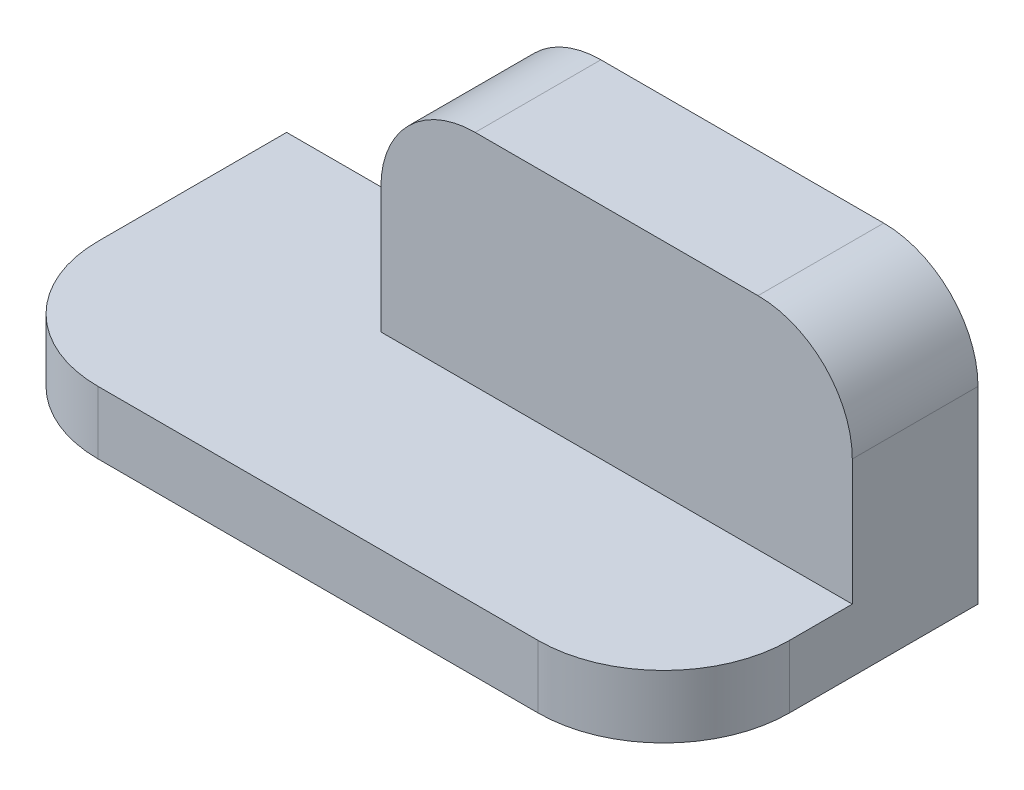
ISO-10303-21;
HEADER;
FILE_DESCRIPTION(('STEP AP214'),'2;1');
FILE_NAME('part.step','',(''),(''),'','','');
FILE_SCHEMA(('AUTOMOTIVE_DESIGN { 1 0 10303 214 1 1 1 1 }'));
ENDSEC;
DATA;
#1=APPLICATION_CONTEXT('core data for automotive mechanical design processes');
#2=APPLICATION_PROTOCOL_DEFINITION('international standard','automotive_design',2000,#1);
#3=PRODUCT_CONTEXT('',#1,'mechanical');
#4=PRODUCT('Part','Part','',(#3));
#5=PRODUCT_RELATED_PRODUCT_CATEGORY('part','',(#4));
#6=PRODUCT_DEFINITION_FORMATION('','',#4);
#7=PRODUCT_DEFINITION_CONTEXT('part definition',#1,'design');
#8=PRODUCT_DEFINITION('design','',#6,#7);
#9=PRODUCT_DEFINITION_SHAPE('','',#8);
#10=(LENGTH_UNIT() NAMED_UNIT(*) SI_UNIT(.MILLI.,.METRE.));
#11=(NAMED_UNIT(*) PLANE_ANGLE_UNIT() SI_UNIT($,.RADIAN.));
#12=(NAMED_UNIT(*) SI_UNIT($,.STERADIAN.) SOLID_ANGLE_UNIT());
#13=UNCERTAINTY_MEASURE_WITH_UNIT(LENGTH_MEASURE(1.E-05),#10,'distance_accuracy_value','');
#14=(GEOMETRIC_REPRESENTATION_CONTEXT(3) GLOBAL_UNCERTAINTY_ASSIGNED_CONTEXT((#13)) GLOBAL_UNIT_ASSIGNED_CONTEXT((#10,
#11,#12)) REPRESENTATION_CONTEXT('',''));
#15=CARTESIAN_POINT('',(0.,0.,0.));
#16=DIRECTION('',(0.,0.,1.));
#17=DIRECTION('',(1.,0.,0.));
#18=AXIS2_PLACEMENT_3D('',#15,#16,#17);
#19=CARTESIAN_POINT('',(0.,10.,0.));
#20=DIRECTION('',(0.,-1.,0.));
#21=DIRECTION('',(0.,0.,-1.));
#22=AXIS2_PLACEMENT_3D('',#19,#20,#21);
#23=PLANE('',#22);
#24=DIRECTION('',(1.,0.,0.));
#25=VECTOR('',#24,1.);
#26=CARTESIAN_POINT('',(0.,10.,0.));
#27=LINE('',#26,#25);
#28=CARTESIAN_POINT('',(20.,10.,0.));
#29=VERTEX_POINT('',#28);
#30=CARTESIAN_POINT('',(90.,10.,0.));
#31=VERTEX_POINT('',#30);
#32=EDGE_CURVE('E165',#29,#31,#27,.T.);
#33=ORIENTED_EDGE('',*,*,#32,.T.);
#34=CARTESIAN_POINT('',(90.,10.,-20.));
#35=DIRECTION('',(0.,-1.,0.));
#36=DIRECTION('',(0.,0.,-1.));
#37=AXIS2_PLACEMENT_3D('',#34,#35,#36);
#38=CIRCLE('',#37,20.);
#39=CARTESIAN_POINT('',(110.,10.,-20.));
#40=VERTEX_POINT('',#39);
#41=EDGE_CURVE('E48',#31,#40,#38,.F.);
#42=ORIENTED_EDGE('',*,*,#41,.T.);
#43=DIRECTION('',(0.,0.,-1.));
#44=VECTOR('',#43,1.);
#45=CARTESIAN_POINT('',(110.,10.,0.));
#46=LINE('',#45,#44);
#47=CARTESIAN_POINT('',(110.,10.,-30.));
#48=VERTEX_POINT('',#47);
#49=EDGE_CURVE('E144',#40,#48,#46,.T.);
#50=ORIENTED_EDGE('',*,*,#49,.T.);
#51=DIRECTION('',(1.,0.,0.));
#52=VECTOR('',#51,1.);
#53=CARTESIAN_POINT('',(110.,10.,-30.));
#54=LINE('',#53,#52);
#55=CARTESIAN_POINT('',(35.,10.,-30.));
#56=VERTEX_POINT('',#55);
#57=EDGE_CURVE('E129',#56,#48,#54,.T.);
#58=ORIENTED_EDGE('',*,*,#57,.F.);
#59=DIRECTION('',(0.,0.,1.));
#60=VECTOR('',#59,1.);
#61=CARTESIAN_POINT('',(35.,10.,-50.));
#62=LINE('',#61,#60);
#63=CARTESIAN_POINT('',(35.,10.,-50.));
#64=VERTEX_POINT('',#63);
#65=EDGE_CURVE('E141',#64,#56,#62,.T.);
#66=ORIENTED_EDGE('',*,*,#65,.F.);
#67=DIRECTION('',(-1.,0.,0.));
#68=VECTOR('',#67,1.);
#69=CARTESIAN_POINT('',(0.,10.,-50.));
#70=LINE('',#69,#68);
#71=CARTESIAN_POINT('',(0.,10.,-50.));
#72=VERTEX_POINT('',#71);
#73=EDGE_CURVE('E171',#64,#72,#70,.T.);
#74=ORIENTED_EDGE('',*,*,#73,.T.);
#75=DIRECTION('',(0.,0.,1.));
#76=VECTOR('',#75,1.);
#77=CARTESIAN_POINT('',(0.,10.,0.));
#78=LINE('',#77,#76);
#79=CARTESIAN_POINT('',(0.,10.,-20.));
#80=VERTEX_POINT('',#79);
#81=EDGE_CURVE('E162',#72,#80,#78,.T.);
#82=ORIENTED_EDGE('',*,*,#81,.T.);
#83=CARTESIAN_POINT('',(20.,10.,-20.));
#84=DIRECTION('',(0.,-1.,0.));
#85=DIRECTION('',(0.,0.,-1.));
#86=AXIS2_PLACEMENT_3D('',#83,#84,#85);
#87=CIRCLE('',#86,20.);
#88=EDGE_CURVE('E233',#80,#29,#87,.F.);
#89=ORIENTED_EDGE('',*,*,#88,.T.);
#90=EDGE_LOOP('',(#33,#42,#50,#58,#66,#74,#82,#89));
#91=FACE_BOUND('',#90,.T.);
#92=ADVANCED_FACE('F39',(#91),#23,.F.);
#93=CARTESIAN_POINT('',(0.,10.,0.));
#94=DIRECTION('',(1.,0.,0.));
#95=DIRECTION('',(0.,0.,-1.));
#96=AXIS2_PLACEMENT_3D('',#93,#94,#95);
#97=PLANE('',#96);
#98=DIRECTION('',(0.,0.,1.));
#99=VECTOR('',#98,1.);
#100=CARTESIAN_POINT('',(0.,0.,0.));
#101=LINE('',#100,#99);
#102=CARTESIAN_POINT('',(0.,0.,-50.));
#103=VERTEX_POINT('',#102);
#104=CARTESIAN_POINT('',(0.,0.,-20.));
#105=VERTEX_POINT('',#104);
#106=EDGE_CURVE('E161',#103,#105,#101,.T.);
#107=ORIENTED_EDGE('',*,*,#106,.T.);
#108=DIRECTION('',(0.,-1.,0.));
#109=VECTOR('',#108,1.);
#110=CARTESIAN_POINT('',(0.,10.,-20.));
#111=LINE('',#110,#109);
#112=EDGE_CURVE('E11',#105,#80,#111,.F.);
#113=ORIENTED_EDGE('',*,*,#112,.T.);
#114=ORIENTED_EDGE('',*,*,#81,.F.);
#115=DIRECTION('',(0.,-1.,0.));
#116=VECTOR('',#115,1.);
#117=CARTESIAN_POINT('',(0.,10.,-50.));
#118=LINE('',#117,#116);
#119=EDGE_CURVE('E174',#72,#103,#118,.T.);
#120=ORIENTED_EDGE('',*,*,#119,.T.);
#121=EDGE_LOOP('',(#107,#113,#114,#120));
#122=FACE_BOUND('',#121,.T.);
#123=ADVANCED_FACE('F252',(#122),#97,.F.);
#124=CARTESIAN_POINT('',(0.,10.,0.));
#125=DIRECTION('',(0.,0.,-1.));
#126=DIRECTION('',(-1.,0.,0.));
#127=AXIS2_PLACEMENT_3D('',#124,#125,#126);
#128=PLANE('',#127);
#129=DIRECTION('',(1.,0.,0.));
#130=VECTOR('',#129,1.);
#131=CARTESIAN_POINT('',(0.,0.,0.));
#132=LINE('',#131,#130);
#133=CARTESIAN_POINT('',(20.,0.,0.));
#134=VERTEX_POINT('',#133);
#135=CARTESIAN_POINT('',(90.,0.,0.));
#136=VERTEX_POINT('',#135);
#137=EDGE_CURVE('E177',#134,#136,#132,.T.);
#138=ORIENTED_EDGE('',*,*,#137,.T.);
#139=DIRECTION('',(0.,-1.,0.));
#140=VECTOR('',#139,1.);
#141=CARTESIAN_POINT('',(90.,10.,0.));
#142=LINE('',#141,#140);
#143=EDGE_CURVE('E61',#136,#31,#142,.F.);
#144=ORIENTED_EDGE('',*,*,#143,.T.);
#145=ORIENTED_EDGE('',*,*,#32,.F.);
#146=DIRECTION('',(0.,-1.,0.));
#147=VECTOR('',#146,1.);
#148=CARTESIAN_POINT('',(20.,10.,0.));
#149=LINE('',#148,#147);
#150=EDGE_CURVE('E227',#29,#134,#149,.T.);
#151=ORIENTED_EDGE('',*,*,#150,.T.);
#152=EDGE_LOOP('',(#138,#144,#145,#151));
#153=FACE_BOUND('',#152,.T.);
#154=ADVANCED_FACE('F247',(#153),#128,.F.);
#155=CARTESIAN_POINT('',(110.,10.,0.));
#156=DIRECTION('',(-1.,0.,0.));
#157=DIRECTION('',(0.,0.,1.));
#158=AXIS2_PLACEMENT_3D('',#155,#156,#157);
#159=PLANE('',#158);
#160=ORIENTED_EDGE('',*,*,#49,.F.);
#161=DIRECTION('',(0.,-1.,0.));
#162=VECTOR('',#161,1.);
#163=CARTESIAN_POINT('',(110.,10.,-20.));
#164=LINE('',#163,#162);
#165=CARTESIAN_POINT('',(110.,0.,-20.));
#166=VERTEX_POINT('',#165);
#167=EDGE_CURVE('E217',#40,#166,#164,.T.);
#168=ORIENTED_EDGE('',*,*,#167,.T.);
#169=DIRECTION('',(0.,0.,-1.));
#170=VECTOR('',#169,1.);
#171=CARTESIAN_POINT('',(110.,0.,0.));
#172=LINE('',#171,#170);
#173=CARTESIAN_POINT('',(110.,0.,-50.));
#174=VERTEX_POINT('',#173);
#175=EDGE_CURVE('E180',#166,#174,#172,.T.);
#176=ORIENTED_EDGE('',*,*,#175,.T.);
#177=DIRECTION('',(0.,-1.,0.));
#178=VECTOR('',#177,1.);
#179=CARTESIAN_POINT('',(110.,10.,-50.));
#180=LINE('',#179,#178);
#181=CARTESIAN_POINT('',(110.,30.,-50.));
#182=VERTEX_POINT('',#181);
#183=EDGE_CURVE('E188',#182,#174,#180,.T.);
#184=ORIENTED_EDGE('',*,*,#183,.F.);
#185=DIRECTION('',(0.,0.,-1.));
#186=VECTOR('',#185,1.);
#187=CARTESIAN_POINT('',(110.,30.,0.));
#188=LINE('',#187,#186);
#189=CARTESIAN_POINT('',(110.,30.,-30.));
#190=VERTEX_POINT('',#189);
#191=EDGE_CURVE('E206',#182,#190,#188,.F.);
#192=ORIENTED_EDGE('',*,*,#191,.T.);
#193=DIRECTION('',(0.,-1.,0.));
#194=VECTOR('',#193,1.);
#195=CARTESIAN_POINT('',(110.,45.,-30.));
#196=LINE('',#195,#194);
#197=EDGE_CURVE('E137',#190,#48,#196,.T.);
#198=ORIENTED_EDGE('',*,*,#197,.T.);
#199=EDGE_LOOP('',(#160,#168,#176,#184,#192,#198));
#200=FACE_BOUND('',#199,.T.);
#201=ADVANCED_FACE('F240',(#200),#159,.F.);
#202=CARTESIAN_POINT('',(0.,10.,-50.));
#203=DIRECTION('',(0.,0.,1.));
#204=DIRECTION('',(1.,0.,0.));
#205=AXIS2_PLACEMENT_3D('',#202,#203,#204);
#206=PLANE('',#205);
#207=DIRECTION('',(-1.,0.,0.));
#208=VECTOR('',#207,1.);
#209=CARTESIAN_POINT('',(110.,45.,-50.));
#210=LINE('',#209,#208);
#211=CARTESIAN_POINT('',(95.,45.,-50.));
#212=VERTEX_POINT('',#211);
#213=CARTESIAN_POINT('',(50.,45.,-50.));
#214=VERTEX_POINT('',#213);
#215=EDGE_CURVE('E147',#212,#214,#210,.T.);
#216=ORIENTED_EDGE('',*,*,#215,.F.);
#217=CARTESIAN_POINT('',(95.,30.,-50.));
#218=DIRECTION('',(0.,0.,1.));
#219=DIRECTION('',(1.,0.,0.));
#220=AXIS2_PLACEMENT_3D('',#217,#218,#219);
#221=CIRCLE('',#220,15.);
#222=EDGE_CURVE('E203',#212,#182,#221,.F.);
#223=ORIENTED_EDGE('',*,*,#222,.T.);
#224=ORIENTED_EDGE('',*,*,#183,.T.);
#225=DIRECTION('',(-1.,0.,0.));
#226=VECTOR('',#225,1.);
#227=CARTESIAN_POINT('',(0.,0.,-50.));
#228=LINE('',#227,#226);
#229=EDGE_CURVE('E166',#174,#103,#228,.T.);
#230=ORIENTED_EDGE('',*,*,#229,.T.);
#231=ORIENTED_EDGE('',*,*,#119,.F.);
#232=ORIENTED_EDGE('',*,*,#73,.F.);
#233=DIRECTION('',(0.,-1.,0.));
#234=VECTOR('',#233,1.);
#235=CARTESIAN_POINT('',(35.,45.,-50.));
#236=LINE('',#235,#234);
#237=CARTESIAN_POINT('',(35.,30.,-50.));
#238=VERTEX_POINT('',#237);
#239=EDGE_CURVE('E136',#238,#64,#236,.T.);
#240=ORIENTED_EDGE('',*,*,#239,.F.);
#241=CARTESIAN_POINT('',(50.,30.,-50.));
#242=DIRECTION('',(0.,0.,1.));
#243=DIRECTION('',(1.,0.,0.));
#244=AXIS2_PLACEMENT_3D('',#241,#242,#243);
#245=CIRCLE('',#244,15.);
#246=EDGE_CURVE('E200',#238,#214,#245,.F.);
#247=ORIENTED_EDGE('',*,*,#246,.T.);
#248=EDGE_LOOP('',(#216,#223,#224,#230,#231,#232,#240,#247));
#249=FACE_BOUND('',#248,.T.);
#250=ADVANCED_FACE('F256',(#249),#206,.F.);
#251=CARTESIAN_POINT('',(0.,0.,0.));
#252=DIRECTION('',(0.,-1.,0.));
#253=DIRECTION('',(0.,0.,-1.));
#254=AXIS2_PLACEMENT_3D('',#251,#252,#253);
#255=PLANE('',#254);
#256=ORIENTED_EDGE('',*,*,#175,.F.);
#257=CARTESIAN_POINT('',(90.,0.,-20.));
#258=DIRECTION('',(0.,-1.,0.));
#259=DIRECTION('',(0.,0.,-1.));
#260=AXIS2_PLACEMENT_3D('',#257,#258,#259);
#261=CIRCLE('',#260,20.);
#262=EDGE_CURVE('E224',#166,#136,#261,.T.);
#263=ORIENTED_EDGE('',*,*,#262,.T.);
#264=ORIENTED_EDGE('',*,*,#137,.F.);
#265=CARTESIAN_POINT('',(20.,0.,-20.));
#266=DIRECTION('',(0.,-1.,0.));
#267=DIRECTION('',(0.,0.,-1.));
#268=AXIS2_PLACEMENT_3D('',#265,#266,#267);
#269=CIRCLE('',#268,20.);
#270=EDGE_CURVE('E221',#134,#105,#269,.T.);
#271=ORIENTED_EDGE('',*,*,#270,.T.);
#272=ORIENTED_EDGE('',*,*,#106,.F.);
#273=ORIENTED_EDGE('',*,*,#229,.F.);
#274=EDGE_LOOP('',(#256,#263,#264,#271,#272,#273));
#275=FACE_BOUND('',#274,.T.);
#276=ADVANCED_FACE('F245',(#275),#255,.T.);
#277=CARTESIAN_POINT('',(35.,45.,-50.));
#278=DIRECTION('',(1.,0.,0.));
#279=DIRECTION('',(0.,0.,-1.));
#280=AXIS2_PLACEMENT_3D('',#277,#278,#279);
#281=PLANE('',#280);
#282=DIRECTION('',(0.,-1.,0.));
#283=VECTOR('',#282,1.);
#284=CARTESIAN_POINT('',(35.,45.,-30.));
#285=LINE('',#284,#283);
#286=CARTESIAN_POINT('',(35.,30.,-30.));
#287=VERTEX_POINT('',#286);
#288=EDGE_CURVE('E125',#287,#56,#285,.T.);
#289=ORIENTED_EDGE('',*,*,#288,.F.);
#290=DIRECTION('',(0.,0.,1.));
#291=VECTOR('',#290,1.);
#292=CARTESIAN_POINT('',(35.,30.,-50.));
#293=LINE('',#292,#291);
#294=EDGE_CURVE('E214',#287,#238,#293,.F.);
#295=ORIENTED_EDGE('',*,*,#294,.T.);
#296=ORIENTED_EDGE('',*,*,#239,.T.);
#297=ORIENTED_EDGE('',*,*,#65,.T.);
#298=EDGE_LOOP('',(#289,#295,#296,#297));
#299=FACE_BOUND('',#298,.T.);
#300=ADVANCED_FACE('F149',(#299),#281,.F.);
#301=CARTESIAN_POINT('',(110.,45.,-30.));
#302=DIRECTION('',(0.,0.,-1.));
#303=DIRECTION('',(-1.,0.,0.));
#304=AXIS2_PLACEMENT_3D('',#301,#302,#303);
#305=PLANE('',#304);
#306=ORIENTED_EDGE('',*,*,#197,.F.);
#307=CARTESIAN_POINT('',(95.,30.,-30.));
#308=DIRECTION('',(0.,0.,-1.));
#309=DIRECTION('',(-1.,0.,0.));
#310=AXIS2_PLACEMENT_3D('',#307,#308,#309);
#311=CIRCLE('',#310,15.);
#312=CARTESIAN_POINT('',(95.,45.,-30.));
#313=VERTEX_POINT('',#312);
#314=EDGE_CURVE('E211',#190,#313,#311,.F.);
#315=ORIENTED_EDGE('',*,*,#314,.T.);
#316=DIRECTION('',(1.,0.,0.));
#317=VECTOR('',#316,1.);
#318=CARTESIAN_POINT('',(110.,45.,-30.));
#319=LINE('',#318,#317);
#320=CARTESIAN_POINT('',(50.,45.,-30.));
#321=VERTEX_POINT('',#320);
#322=EDGE_CURVE('E154',#321,#313,#319,.T.);
#323=ORIENTED_EDGE('',*,*,#322,.F.);
#324=CARTESIAN_POINT('',(50.,30.,-30.));
#325=DIRECTION('',(0.,0.,-1.));
#326=DIRECTION('',(-1.,0.,0.));
#327=AXIS2_PLACEMENT_3D('',#324,#325,#326);
#328=CIRCLE('',#327,15.);
#329=EDGE_CURVE('E131',#321,#287,#328,.F.);
#330=ORIENTED_EDGE('',*,*,#329,.T.);
#331=ORIENTED_EDGE('',*,*,#288,.T.);
#332=ORIENTED_EDGE('',*,*,#57,.T.);
#333=EDGE_LOOP('',(#306,#315,#323,#330,#331,#332));
#334=FACE_BOUND('',#333,.T.);
#335=ADVANCED_FACE('F128',(#334),#305,.F.);
#336=CARTESIAN_POINT('',(0.,45.,0.));
#337=DIRECTION('',(0.,-1.,0.));
#338=DIRECTION('',(0.,0.,-1.));
#339=AXIS2_PLACEMENT_3D('',#336,#337,#338);
#340=PLANE('',#339);
#341=ORIENTED_EDGE('',*,*,#322,.T.);
#342=DIRECTION('',(0.,0.,-1.));
#343=VECTOR('',#342,1.);
#344=CARTESIAN_POINT('',(95.,45.,0.));
#345=LINE('',#344,#343);
#346=EDGE_CURVE('E196',#313,#212,#345,.T.);
#347=ORIENTED_EDGE('',*,*,#346,.T.);
#348=ORIENTED_EDGE('',*,*,#215,.T.);
#349=DIRECTION('',(0.,0.,1.));
#350=VECTOR('',#349,1.);
#351=CARTESIAN_POINT('',(50.,45.,0.));
#352=LINE('',#351,#350);
#353=EDGE_CURVE('E192',#214,#321,#352,.T.);
#354=ORIENTED_EDGE('',*,*,#353,.T.);
#355=EDGE_LOOP('',(#341,#347,#348,#354));
#356=FACE_BOUND('',#355,.T.);
#357=ADVANCED_FACE('F265',(#356),#340,.F.);
#358=CARTESIAN_POINT('',(95.,30.,0.));
#359=DIRECTION('',(0.,0.,-1.));
#360=DIRECTION('',(-1.,0.,0.));
#361=AXIS2_PLACEMENT_3D('',#358,#359,#360);
#362=CYLINDRICAL_SURFACE('',#361,15.);
#363=ORIENTED_EDGE('',*,*,#314,.F.);
#364=ORIENTED_EDGE('',*,*,#191,.F.);
#365=ORIENTED_EDGE('',*,*,#222,.F.);
#366=ORIENTED_EDGE('',*,*,#346,.F.);
#367=EDGE_LOOP('',(#363,#364,#365,#366));
#368=FACE_BOUND('',#367,.T.);
#369=ADVANCED_FACE('F261',(#368),#362,.T.);
#370=CARTESIAN_POINT('',(50.,30.,0.));
#371=DIRECTION('',(0.,0.,1.));
#372=DIRECTION('',(1.,0.,0.));
#373=AXIS2_PLACEMENT_3D('',#370,#371,#372);
#374=CYLINDRICAL_SURFACE('',#373,15.);
#375=ORIENTED_EDGE('',*,*,#246,.F.);
#376=ORIENTED_EDGE('',*,*,#294,.F.);
#377=ORIENTED_EDGE('',*,*,#329,.F.);
#378=ORIENTED_EDGE('',*,*,#353,.F.);
#379=EDGE_LOOP('',(#375,#376,#377,#378));
#380=FACE_BOUND('',#379,.T.);
#381=ADVANCED_FACE('F272',(#380),#374,.T.);
#382=CARTESIAN_POINT('',(90.,10.,-20.));
#383=DIRECTION('',(0.,-1.,0.));
#384=DIRECTION('',(0.,0.,-1.));
#385=AXIS2_PLACEMENT_3D('',#382,#383,#384);
#386=CYLINDRICAL_SURFACE('',#385,20.);
#387=ORIENTED_EDGE('',*,*,#41,.F.);
#388=ORIENTED_EDGE('',*,*,#143,.F.);
#389=ORIENTED_EDGE('',*,*,#262,.F.);
#390=ORIENTED_EDGE('',*,*,#167,.F.);
#391=EDGE_LOOP('',(#387,#388,#389,#390));
#392=FACE_BOUND('',#391,.T.);
#393=ADVANCED_FACE('F242',(#392),#386,.T.);
#394=CARTESIAN_POINT('',(20.,10.,-20.));
#395=DIRECTION('',(0.,-1.,0.));
#396=DIRECTION('',(0.,0.,-1.));
#397=AXIS2_PLACEMENT_3D('',#394,#395,#396);
#398=CYLINDRICAL_SURFACE('',#397,20.);
#399=ORIENTED_EDGE('',*,*,#88,.F.);
#400=ORIENTED_EDGE('',*,*,#112,.F.);
#401=ORIENTED_EDGE('',*,*,#270,.F.);
#402=ORIENTED_EDGE('',*,*,#150,.F.);
#403=EDGE_LOOP('',(#399,#400,#401,#402));
#404=FACE_BOUND('',#403,.T.);
#405=ADVANCED_FACE('F41',(#404),#398,.T.);
#406=CLOSED_SHELL('',(#92,#123,#154,#201,#250,#276,#300,#335,#357,#369,#381,#393,#405));
#407=MANIFOLD_SOLID_BREP('B2',#406);
#408=ADVANCED_BREP_SHAPE_REPRESENTATION('',(#18,#407),#14);
#409=SHAPE_DEFINITION_REPRESENTATION(#9,#408);
ENDSEC;
END-ISO-10303-21;
